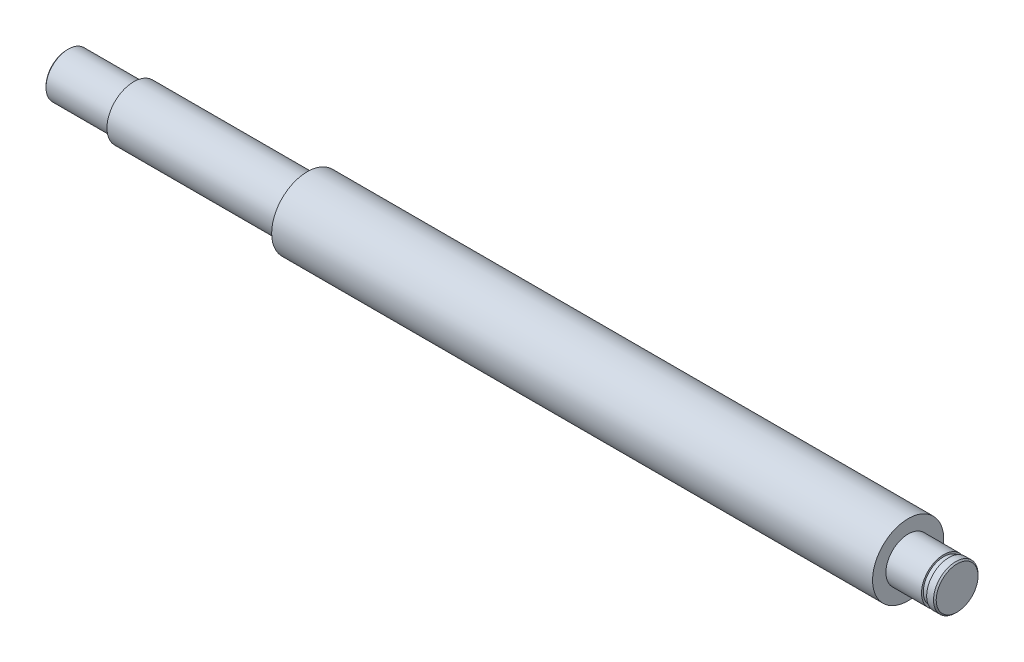
ISO-10303-21;
HEADER;
FILE_DESCRIPTION(('STEP AP214'),'2;1');
FILE_NAME('part.step','',(''),(''),'','','');
FILE_SCHEMA(('AUTOMOTIVE_DESIGN { 1 0 10303 214 1 1 1 1 }'));
ENDSEC;
DATA;
#1=APPLICATION_CONTEXT('core data for automotive mechanical design processes');
#2=APPLICATION_PROTOCOL_DEFINITION('international standard','automotive_design',2000,#1);
#3=PRODUCT_CONTEXT('',#1,'mechanical');
#4=PRODUCT('Part','Part','',(#3));
#5=PRODUCT_RELATED_PRODUCT_CATEGORY('part','',(#4));
#6=PRODUCT_DEFINITION_FORMATION('','',#4);
#7=PRODUCT_DEFINITION_CONTEXT('part definition',#1,'design');
#8=PRODUCT_DEFINITION('design','',#6,#7);
#9=PRODUCT_DEFINITION_SHAPE('','',#8);
#10=(LENGTH_UNIT() NAMED_UNIT(*) SI_UNIT(.MILLI.,.METRE.));
#11=(NAMED_UNIT(*) PLANE_ANGLE_UNIT() SI_UNIT($,.RADIAN.));
#12=(NAMED_UNIT(*) SI_UNIT($,.STERADIAN.) SOLID_ANGLE_UNIT());
#13=UNCERTAINTY_MEASURE_WITH_UNIT(LENGTH_MEASURE(1.E-05),#10,'distance_accuracy_value','');
#14=(GEOMETRIC_REPRESENTATION_CONTEXT(3) GLOBAL_UNCERTAINTY_ASSIGNED_CONTEXT((#13)) GLOBAL_UNIT_ASSIGNED_CONTEXT((#10,
#11,#12)) REPRESENTATION_CONTEXT('',''));
#15=CARTESIAN_POINT('',(0.,0.,0.));
#16=DIRECTION('',(0.,0.,1.));
#17=DIRECTION('',(1.,0.,0.));
#18=AXIS2_PLACEMENT_3D('',#15,#16,#17);
#19=CARTESIAN_POINT('',(-100.,0.,0.));
#20=DIRECTION('',(-1.,0.,0.));
#21=DIRECTION('',(0.,0.,0.999999999999999));
#22=AXIS2_PLACEMENT_3D('',#19,#20,#21);
#23=CYLINDRICAL_SURFACE('',#22,5.);
#24=CARTESIAN_POINT('',(89.,0.,0.));
#25=DIRECTION('',(-1.,0.,0.));
#26=DIRECTION('',(0.,0.,0.999999999999999));
#27=AXIS2_PLACEMENT_3D('',#24,#25,#26);
#28=CIRCLE('',#27,5.);
#29=CARTESIAN_POINT('',(89.,0.,5.));
#30=VERTEX_POINT('',#29);
#31=EDGE_CURVE('E69',#30,#30,#28,.T.);
#32=ORIENTED_EDGE('',*,*,#31,.F.);
#33=EDGE_LOOP('',(#32));
#34=FACE_BOUND('',#33,.T.);
#35=CARTESIAN_POINT('',(97.,0.,0.));
#36=DIRECTION('',(-1.,0.,0.));
#37=DIRECTION('',(0.,0.,0.999999999999999));
#38=AXIS2_PLACEMENT_3D('',#35,#36,#37);
#39=CIRCLE('',#38,5.);
#40=CARTESIAN_POINT('',(97.,0.,5.));
#41=VERTEX_POINT('',#40);
#42=EDGE_CURVE('E81',#41,#41,#39,.T.);
#43=ORIENTED_EDGE('',*,*,#42,.T.);
#44=EDGE_LOOP('',(#43));
#45=FACE_BOUND('',#44,.T.);
#46=ADVANCED_FACE('F34',(#34,#45),#23,.T.);
#47=CARTESIAN_POINT('',(-100.,0.,0.));
#48=DIRECTION('',(1.,0.,0.));
#49=DIRECTION('',(0.,0.,-0.999999999999999));
#50=AXIS2_PLACEMENT_3D('',#47,#48,#49);
#51=PLANE('',#50);
#52=CARTESIAN_POINT('',(-100.,0.,0.));
#53=DIRECTION('',(1.,0.,0.));
#54=DIRECTION('',(0.,0.,-0.999999999999999));
#55=AXIS2_PLACEMENT_3D('',#52,#53,#54);
#56=CIRCLE('',#55,4.69999999999998);
#57=CARTESIAN_POINT('',(-100.,0.,-4.69999999999998));
#58=VERTEX_POINT('',#57);
#59=EDGE_CURVE('E49',#58,#58,#56,.F.);
#60=ORIENTED_EDGE('',*,*,#59,.T.);
#61=EDGE_LOOP('',(#60));
#62=FACE_BOUND('',#61,.T.);
#63=ADVANCED_FACE('F104',(#62),#51,.F.);
#64=CARTESIAN_POINT('',(-100.,0.,0.));
#65=DIRECTION('',(-1.,0.,0.));
#66=DIRECTION('',(0.,0.,0.999999999999999));
#67=AXIS2_PLACEMENT_3D('',#64,#65,#66);
#68=CYLINDRICAL_SURFACE('',#67,5.);
#69=CARTESIAN_POINT('',(-99.7,0.,0.));
#70=DIRECTION('',(1.,0.,0.));
#71=DIRECTION('',(0.,0.,-0.999999999999999));
#72=AXIS2_PLACEMENT_3D('',#69,#70,#71);
#73=CIRCLE('',#72,5.);
#74=CARTESIAN_POINT('',(-99.7,0.,-5.));
#75=VERTEX_POINT('',#74);
#76=EDGE_CURVE('E45',#75,#75,#73,.T.);
#77=ORIENTED_EDGE('',*,*,#76,.T.);
#78=EDGE_LOOP('',(#77));
#79=FACE_BOUND('',#78,.T.);
#80=CARTESIAN_POINT('',(-85.,0.,0.));
#81=DIRECTION('',(-1.,0.,0.));
#82=DIRECTION('',(0.,0.,0.999999999999999));
#83=AXIS2_PLACEMENT_3D('',#80,#81,#82);
#84=CIRCLE('',#83,5.);
#85=CARTESIAN_POINT('',(-85.,0.,5.));
#86=VERTEX_POINT('',#85);
#87=EDGE_CURVE('E54',#86,#86,#84,.T.);
#88=ORIENTED_EDGE('',*,*,#87,.T.);
#89=EDGE_LOOP('',(#88));
#90=FACE_BOUND('',#89,.T.);
#91=ADVANCED_FACE('F111',(#79,#90),#68,.T.);
#92=CARTESIAN_POINT('',(-85.,5.,0.));
#93=DIRECTION('',(1.,0.,0.));
#94=DIRECTION('',(0.,0.,-0.999999999999999));
#95=AXIS2_PLACEMENT_3D('',#92,#93,#94);
#96=PLANE('',#95);
#97=ORIENTED_EDGE('',*,*,#87,.F.);
#98=EDGE_LOOP('',(#97));
#99=FACE_BOUND('',#98,.T.);
#100=CARTESIAN_POINT('',(-85.,0.,0.));
#101=DIRECTION('',(-1.,0.,0.));
#102=DIRECTION('',(0.,0.,0.999999999999999));
#103=AXIS2_PLACEMENT_3D('',#100,#101,#102);
#104=CIRCLE('',#103,6.);
#105=CARTESIAN_POINT('',(-85.,0.,6.));
#106=VERTEX_POINT('',#105);
#107=EDGE_CURVE('E57',#106,#106,#104,.T.);
#108=ORIENTED_EDGE('',*,*,#107,.T.);
#109=EDGE_LOOP('',(#108));
#110=FACE_BOUND('',#109,.T.);
#111=ADVANCED_FACE('F178',(#99,#110),#96,.F.);
#112=CARTESIAN_POINT('',(-100.,0.,0.));
#113=DIRECTION('',(-1.,0.,0.));
#114=DIRECTION('',(0.,0.,0.999999999999999));
#115=AXIS2_PLACEMENT_3D('',#112,#113,#114);
#116=CYLINDRICAL_SURFACE('',#115,6.);
#117=ORIENTED_EDGE('',*,*,#107,.F.);
#118=EDGE_LOOP('',(#117));
#119=FACE_BOUND('',#118,.T.);
#120=CARTESIAN_POINT('',(-46.,0.,0.));
#121=DIRECTION('',(-1.,0.,0.));
#122=DIRECTION('',(0.,0.,0.999999999999999));
#123=AXIS2_PLACEMENT_3D('',#120,#121,#122);
#124=CIRCLE('',#123,6.);
#125=CARTESIAN_POINT('',(-46.,0.,6.));
#126=VERTEX_POINT('',#125);
#127=EDGE_CURVE('E60',#126,#126,#124,.T.);
#128=ORIENTED_EDGE('',*,*,#127,.T.);
#129=EDGE_LOOP('',(#128));
#130=FACE_BOUND('',#129,.T.);
#131=ADVANCED_FACE('F170',(#119,#130),#116,.T.);
#132=CARTESIAN_POINT('',(-46.,6.,0.));
#133=DIRECTION('',(1.,0.,0.));
#134=DIRECTION('',(0.,0.,-0.999999999999999));
#135=AXIS2_PLACEMENT_3D('',#132,#133,#134);
#136=PLANE('',#135);
#137=ORIENTED_EDGE('',*,*,#127,.F.);
#138=EDGE_LOOP('',(#137));
#139=FACE_BOUND('',#138,.T.);
#140=CARTESIAN_POINT('',(-46.,0.,0.));
#141=DIRECTION('',(-1.,0.,0.));
#142=DIRECTION('',(0.,0.,0.999999999999999));
#143=AXIS2_PLACEMENT_3D('',#140,#141,#142);
#144=CIRCLE('',#143,8.);
#145=CARTESIAN_POINT('',(-46.,0.,8.));
#146=VERTEX_POINT('',#145);
#147=EDGE_CURVE('E63',#146,#146,#144,.T.);
#148=ORIENTED_EDGE('',*,*,#147,.T.);
#149=EDGE_LOOP('',(#148));
#150=FACE_BOUND('',#149,.T.);
#151=ADVANCED_FACE('F161',(#139,#150),#136,.F.);
#152=CARTESIAN_POINT('',(-100.,0.,0.));
#153=DIRECTION('',(-1.,0.,0.));
#154=DIRECTION('',(0.,0.,0.999999999999999));
#155=AXIS2_PLACEMENT_3D('',#152,#153,#154);
#156=CYLINDRICAL_SURFACE('',#155,8.);
#157=ORIENTED_EDGE('',*,*,#147,.F.);
#158=EDGE_LOOP('',(#157));
#159=FACE_BOUND('',#158,.T.);
#160=CARTESIAN_POINT('',(89.,0.,0.));
#161=DIRECTION('',(-1.,0.,0.));
#162=DIRECTION('',(0.,0.,0.999999999999999));
#163=AXIS2_PLACEMENT_3D('',#160,#161,#162);
#164=CIRCLE('',#163,8.);
#165=CARTESIAN_POINT('',(89.,0.,8.));
#166=VERTEX_POINT('',#165);
#167=EDGE_CURVE('E66',#166,#166,#164,.T.);
#168=ORIENTED_EDGE('',*,*,#167,.T.);
#169=EDGE_LOOP('',(#168));
#170=FACE_BOUND('',#169,.T.);
#171=ADVANCED_FACE('F99',(#159,#170),#156,.T.);
#172=CARTESIAN_POINT('',(89.,8.,0.));
#173=DIRECTION('',(-1.,0.,0.));
#174=DIRECTION('',(0.,0.,0.999999999999999));
#175=AXIS2_PLACEMENT_3D('',#172,#173,#174);
#176=PLANE('',#175);
#177=ORIENTED_EDGE('',*,*,#167,.F.);
#178=EDGE_LOOP('',(#177));
#179=FACE_BOUND('',#178,.T.);
#180=ORIENTED_EDGE('',*,*,#31,.T.);
#181=EDGE_LOOP('',(#180));
#182=FACE_BOUND('',#181,.T.);
#183=ADVANCED_FACE('F89',(#179,#182),#176,.F.);
#184=CARTESIAN_POINT('',(97.,5.,0.));
#185=DIRECTION('',(1.,0.,0.));
#186=DIRECTION('',(0.,0.,-0.999999999999999));
#187=AXIS2_PLACEMENT_3D('',#184,#185,#186);
#188=PLANE('',#187);
#189=CARTESIAN_POINT('',(97.,0.,0.));
#190=DIRECTION('',(-1.,0.,0.));
#191=DIRECTION('',(0.,0.,0.999999999999999));
#192=AXIS2_PLACEMENT_3D('',#189,#190,#191);
#193=CIRCLE('',#192,4.6);
#194=CARTESIAN_POINT('',(97.,0.,4.6));
#195=VERTEX_POINT('',#194);
#196=EDGE_CURVE('E72',#195,#195,#193,.T.);
#197=ORIENTED_EDGE('',*,*,#196,.T.);
#198=EDGE_LOOP('',(#197));
#199=FACE_BOUND('',#198,.T.);
#200=ORIENTED_EDGE('',*,*,#42,.F.);
#201=EDGE_LOOP('',(#200));
#202=FACE_BOUND('',#201,.T.);
#203=ADVANCED_FACE('F86',(#199,#202),#188,.T.);
#204=CARTESIAN_POINT('',(89.,0.,0.));
#205=DIRECTION('',(-1.,0.,0.));
#206=DIRECTION('',(0.,0.,0.999999999999999));
#207=AXIS2_PLACEMENT_3D('',#204,#205,#206);
#208=CYLINDRICAL_SURFACE('',#207,4.6);
#209=CARTESIAN_POINT('',(98.15,0.,0.));
#210=DIRECTION('',(-1.,0.,0.));
#211=DIRECTION('',(0.,0.,0.999999999999999));
#212=AXIS2_PLACEMENT_3D('',#209,#210,#211);
#213=CIRCLE('',#212,4.6);
#214=CARTESIAN_POINT('',(98.15,0.,4.6));
#215=VERTEX_POINT('',#214);
#216=EDGE_CURVE('E75',#215,#215,#213,.T.);
#217=ORIENTED_EDGE('',*,*,#216,.T.);
#218=EDGE_LOOP('',(#217));
#219=FACE_BOUND('',#218,.T.);
#220=ORIENTED_EDGE('',*,*,#196,.F.);
#221=EDGE_LOOP('',(#220));
#222=FACE_BOUND('',#221,.T.);
#223=ADVANCED_FACE('F88',(#219,#222),#208,.T.);
#224=CARTESIAN_POINT('',(98.15,5.,0.));
#225=DIRECTION('',(-1.,0.,0.));
#226=DIRECTION('',(0.,0.,0.999999999999999));
#227=AXIS2_PLACEMENT_3D('',#224,#225,#226);
#228=PLANE('',#227);
#229=CARTESIAN_POINT('',(98.15,0.,0.));
#230=DIRECTION('',(-1.,0.,0.));
#231=DIRECTION('',(0.,0.,0.999999999999999));
#232=AXIS2_PLACEMENT_3D('',#229,#230,#231);
#233=CIRCLE('',#232,5.);
#234=CARTESIAN_POINT('',(98.15,0.,5.));
#235=VERTEX_POINT('',#234);
#236=EDGE_CURVE('E78',#235,#235,#233,.T.);
#237=ORIENTED_EDGE('',*,*,#236,.T.);
#238=EDGE_LOOP('',(#237));
#239=FACE_BOUND('',#238,.T.);
#240=ORIENTED_EDGE('',*,*,#216,.F.);
#241=EDGE_LOOP('',(#240));
#242=FACE_BOUND('',#241,.T.);
#243=ADVANCED_FACE('F96',(#239,#242),#228,.T.);
#244=CARTESIAN_POINT('',(100.,5.00000000000001,0.));
#245=DIRECTION('',(-1.,0.,0.));
#246=DIRECTION('',(0.,0.,0.999999999999999));
#247=AXIS2_PLACEMENT_3D('',#244,#245,#246);
#248=PLANE('',#247);
#249=CARTESIAN_POINT('',(100.,0.,0.));
#250=DIRECTION('',(-1.,0.,0.));
#251=DIRECTION('',(0.,0.,0.999999999999999));
#252=AXIS2_PLACEMENT_3D('',#249,#250,#251);
#253=CIRCLE('',#252,4.70000000000004);
#254=CARTESIAN_POINT('',(100.,0.,4.70000000000003));
#255=VERTEX_POINT('',#254);
#256=EDGE_CURVE('E10',#255,#255,#253,.F.);
#257=ORIENTED_EDGE('',*,*,#256,.T.);
#258=EDGE_LOOP('',(#257));
#259=FACE_BOUND('',#258,.T.);
#260=ADVANCED_FACE('F117',(#259),#248,.F.);
#261=CARTESIAN_POINT('',(99.7,0.,0.));
#262=DIRECTION('',(-1.,0.,0.));
#263=DIRECTION('',(0.,0.,0.999999999999999));
#264=AXIS2_PLACEMENT_3D('',#261,#262,#263);
#265=CIRCLE('',#264,5.);
#266=CARTESIAN_POINT('',(99.7,0.,4.99999999999999));
#267=VERTEX_POINT('',#266);
#268=EDGE_CURVE('E41',#267,#267,#265,.T.);
#269=ORIENTED_EDGE('',*,*,#268,.T.);
#270=EDGE_LOOP('',(#269));
#271=FACE_BOUND('',#270,.T.);
#272=ORIENTED_EDGE('',*,*,#236,.F.);
#273=EDGE_LOOP('',(#272));
#274=FACE_BOUND('',#273,.T.);
#275=ADVANCED_FACE('F107',(#271,#274),#23,.T.);
#276=CARTESIAN_POINT('',(-100.,0.,0.));
#277=DIRECTION('',(1.,0.,0.));
#278=DIRECTION('',(0.,0.,-0.999999999999999));
#279=AXIS2_PLACEMENT_3D('',#276,#277,#278);
#280=CONICAL_SURFACE('',#279,4.69999999999998,0.785398163397487);
#281=ORIENTED_EDGE('',*,*,#76,.F.);
#282=EDGE_LOOP('',(#281));
#283=FACE_BOUND('',#282,.T.);
#284=ORIENTED_EDGE('',*,*,#59,.F.);
#285=EDGE_LOOP('',(#284));
#286=FACE_BOUND('',#285,.T.);
#287=ADVANCED_FACE('F116',(#283,#286),#280,.T.);
#288=CARTESIAN_POINT('',(99.7,0.,0.));
#289=DIRECTION('',(-1.,0.,0.));
#290=DIRECTION('',(0.,0.,0.999999999999999));
#291=AXIS2_PLACEMENT_3D('',#288,#289,#290);
#292=CONICAL_SURFACE('',#291,5.,0.78539816339744);
#293=ORIENTED_EDGE('',*,*,#256,.F.);
#294=EDGE_LOOP('',(#293));
#295=FACE_BOUND('',#294,.T.);
#296=ORIENTED_EDGE('',*,*,#268,.F.);
#297=EDGE_LOOP('',(#296));
#298=FACE_BOUND('',#297,.T.);
#299=ADVANCED_FACE('F36',(#295,#298),#292,.T.);
#300=CLOSED_SHELL('',(#46,#63,#91,#111,#131,#151,#171,#183,#203,#223,#243,#260,#275,#287,#299));
#301=MANIFOLD_SOLID_BREP('B2',#300);
#302=ADVANCED_BREP_SHAPE_REPRESENTATION('',(#18,#301),#14);
#303=SHAPE_DEFINITION_REPRESENTATION(#9,#302);
ENDSEC;
END-ISO-10303-21;
